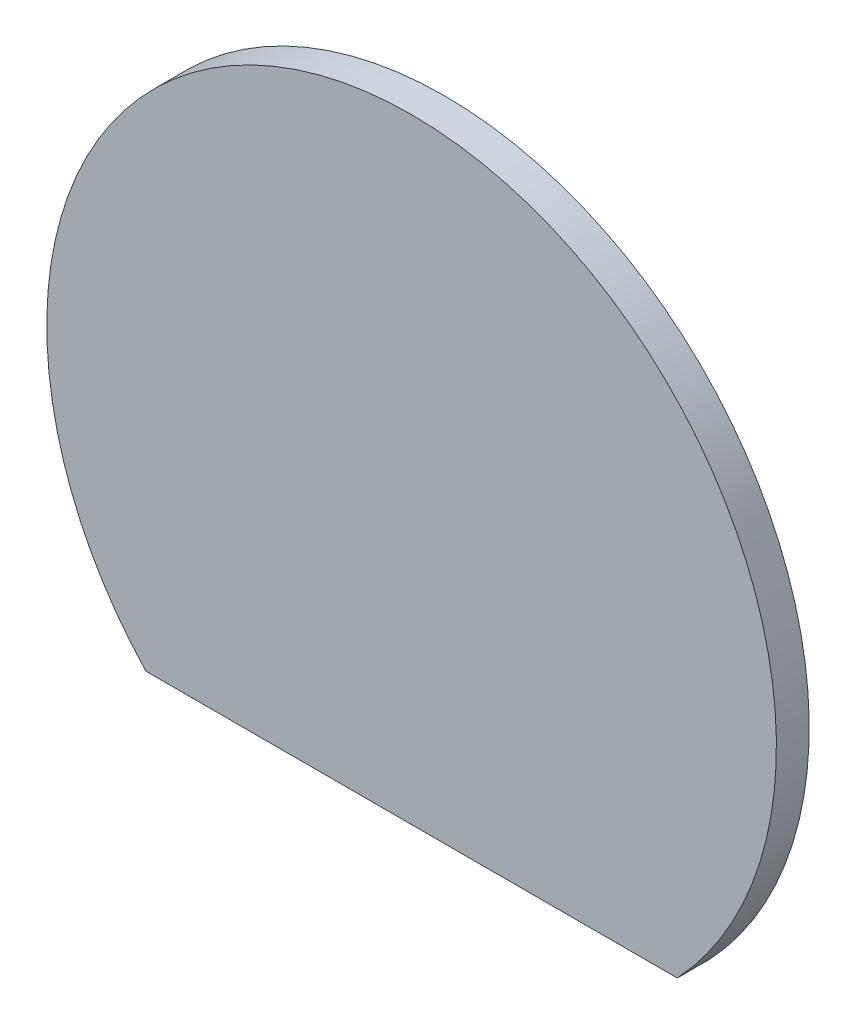
ISO-10303-21;
HEADER;
FILE_DESCRIPTION(('STEP AP214'),'2;1');
FILE_NAME('part.step','',(''),(''),'','','');
FILE_SCHEMA(('AUTOMOTIVE_DESIGN { 1 0 10303 214 1 1 1 1 }'));
ENDSEC;
DATA;
#1=APPLICATION_CONTEXT('core data for automotive mechanical design processes');
#2=APPLICATION_PROTOCOL_DEFINITION('international standard','automotive_design',2000,#1);
#3=PRODUCT_CONTEXT('',#1,'mechanical');
#4=PRODUCT('Part','Part','',(#3));
#5=PRODUCT_RELATED_PRODUCT_CATEGORY('part','',(#4));
#6=PRODUCT_DEFINITION_FORMATION('','',#4);
#7=PRODUCT_DEFINITION_CONTEXT('part definition',#1,'design');
#8=PRODUCT_DEFINITION('design','',#6,#7);
#9=PRODUCT_DEFINITION_SHAPE('','',#8);
#10=(LENGTH_UNIT() NAMED_UNIT(*) SI_UNIT(.MILLI.,.METRE.));
#11=(NAMED_UNIT(*) PLANE_ANGLE_UNIT() SI_UNIT($,.RADIAN.));
#12=(NAMED_UNIT(*) SI_UNIT($,.STERADIAN.) SOLID_ANGLE_UNIT());
#13=UNCERTAINTY_MEASURE_WITH_UNIT(LENGTH_MEASURE(1.E-05),#10,'distance_accuracy_value','');
#14=(GEOMETRIC_REPRESENTATION_CONTEXT(3) GLOBAL_UNCERTAINTY_ASSIGNED_CONTEXT((#13)) GLOBAL_UNIT_ASSIGNED_CONTEXT((#10,
#11,#12)) REPRESENTATION_CONTEXT('',''));
#15=CARTESIAN_POINT('',(0.,0.,0.));
#16=DIRECTION('',(0.,0.,1.));
#17=DIRECTION('',(1.,0.,0.));
#18=AXIS2_PLACEMENT_3D('',#15,#16,#17);
#19=CARTESIAN_POINT('',(0.,0.,1.6));
#20=DIRECTION('',(0.,0.,-1.));
#21=DIRECTION('',(-1.,0.,0.));
#22=AXIS2_PLACEMENT_3D('',#19,#20,#21);
#23=CYLINDRICAL_SURFACE('',#22,17.8);
#24=CARTESIAN_POINT('',(0.,0.,0.));
#25=DIRECTION('',(0.,0.,1.));
#26=DIRECTION('',(1.,0.,0.));
#27=AXIS2_PLACEMENT_3D('',#24,#25,#26);
#28=CIRCLE('',#27,17.8);
#29=CARTESIAN_POINT('',(12.9614813968157,-12.2,0.));
#30=VERTEX_POINT('',#29);
#31=CARTESIAN_POINT('',(-12.9614813968157,-12.2,0.));
#32=VERTEX_POINT('',#31);
#33=EDGE_CURVE('E82',#30,#32,#28,.T.);
#34=ORIENTED_EDGE('',*,*,#33,.T.);
#35=DIRECTION('',(0.,0.,-1.));
#36=VECTOR('',#35,1.);
#37=CARTESIAN_POINT('',(-12.9614813968157,-12.2,1.6));
#38=LINE('',#37,#36);
#39=CARTESIAN_POINT('',(-12.9614813968157,-12.2,1.6));
#40=VERTEX_POINT('',#39);
#41=EDGE_CURVE('E11',#40,#32,#38,.T.);
#42=ORIENTED_EDGE('',*,*,#41,.F.);
#43=CARTESIAN_POINT('',(0.,0.,1.6));
#44=DIRECTION('',(0.,0.,1.));
#45=DIRECTION('',(1.,0.,0.));
#46=AXIS2_PLACEMENT_3D('',#43,#44,#45);
#47=CIRCLE('',#46,17.8);
#48=CARTESIAN_POINT('',(12.9614813968157,-12.2,1.6));
#49=VERTEX_POINT('',#48);
#50=EDGE_CURVE('E81',#49,#40,#47,.T.);
#51=ORIENTED_EDGE('',*,*,#50,.F.);
#52=DIRECTION('',(0.,0.,-1.));
#53=VECTOR('',#52,1.);
#54=CARTESIAN_POINT('',(12.9614813968157,-12.2,1.6));
#55=LINE('',#54,#53);
#56=EDGE_CURVE('E58',#49,#30,#55,.T.);
#57=ORIENTED_EDGE('',*,*,#56,.T.);
#58=EDGE_LOOP('',(#34,#42,#51,#57));
#59=FACE_BOUND('',#58,.T.);
#60=ADVANCED_FACE('F49',(#59),#23,.T.);
#61=CARTESIAN_POINT('',(-12.9614813968157,-12.2,1.6));
#62=DIRECTION('',(0.,1.,0.));
#63=DIRECTION('',(0.,0.,1.));
#64=AXIS2_PLACEMENT_3D('',#61,#62,#63);
#65=PLANE('',#64);
#66=DIRECTION('',(1.,0.,0.));
#67=VECTOR('',#66,1.);
#68=CARTESIAN_POINT('',(-12.9614813968157,-12.2,0.));
#69=LINE('',#68,#67);
#70=EDGE_CURVE('E73',#32,#30,#69,.T.);
#71=ORIENTED_EDGE('',*,*,#70,.T.);
#72=ORIENTED_EDGE('',*,*,#56,.F.);
#73=DIRECTION('',(1.,0.,0.));
#74=VECTOR('',#73,1.);
#75=CARTESIAN_POINT('',(-12.9614813968157,-12.2,1.6));
#76=LINE('',#75,#74);
#77=EDGE_CURVE('E65',#40,#49,#76,.T.);
#78=ORIENTED_EDGE('',*,*,#77,.F.);
#79=ORIENTED_EDGE('',*,*,#41,.T.);
#80=EDGE_LOOP('',(#71,#72,#78,#79));
#81=FACE_BOUND('',#80,.T.);
#82=ADVANCED_FACE('F76',(#81),#65,.F.);
#83=CARTESIAN_POINT('',(0.,0.,1.6));
#84=DIRECTION('',(0.,0.,1.));
#85=DIRECTION('',(1.,0.,0.));
#86=AXIS2_PLACEMENT_3D('',#83,#84,#85);
#87=PLANE('',#86);
#88=ORIENTED_EDGE('',*,*,#50,.T.);
#89=ORIENTED_EDGE('',*,*,#77,.T.);
#90=EDGE_LOOP('',(#88,#89));
#91=FACE_BOUND('',#90,.T.);
#92=ADVANCED_FACE('F93',(#91),#87,.T.);
#93=CARTESIAN_POINT('',(0.,0.,0.));
#94=DIRECTION('',(0.,0.,1.));
#95=DIRECTION('',(1.,0.,0.));
#96=AXIS2_PLACEMENT_3D('',#93,#94,#95);
#97=PLANE('',#96);
#98=ORIENTED_EDGE('',*,*,#33,.F.);
#99=ORIENTED_EDGE('',*,*,#70,.F.);
#100=EDGE_LOOP('',(#98,#99));
#101=FACE_BOUND('',#100,.T.);
#102=ADVANCED_FACE('F86',(#101),#97,.F.);
#103=CLOSED_SHELL('',(#60,#82,#92,#102));
#104=MANIFOLD_SOLID_BREP('B2',#103);
#105=ADVANCED_BREP_SHAPE_REPRESENTATION('',(#18,#104),#14);
#106=SHAPE_DEFINITION_REPRESENTATION(#9,#105);
ENDSEC;
END-ISO-10303-21;
